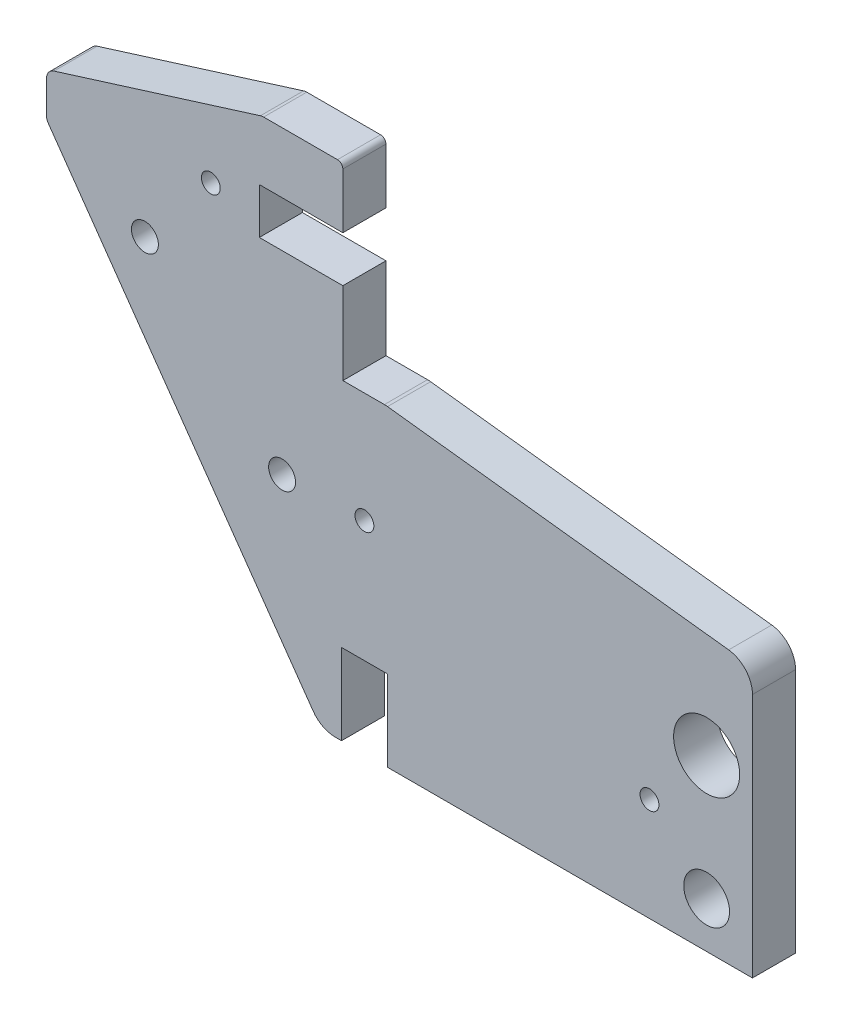
ISO-10303-21;
HEADER;
FILE_DESCRIPTION(('STEP AP214'),'2;1');
FILE_NAME('part.step','',(''),(''),'','','');
FILE_SCHEMA(('AUTOMOTIVE_DESIGN { 1 0 10303 214 1 1 1 1 }'));
ENDSEC;
DATA;
#1=APPLICATION_CONTEXT('core data for automotive mechanical design processes');
#2=APPLICATION_PROTOCOL_DEFINITION('international standard','automotive_design',2000,#1);
#3=PRODUCT_CONTEXT('',#1,'mechanical');
#4=PRODUCT('Part','Part','',(#3));
#5=PRODUCT_RELATED_PRODUCT_CATEGORY('part','',(#4));
#6=PRODUCT_DEFINITION_FORMATION('','',#4);
#7=PRODUCT_DEFINITION_CONTEXT('part definition',#1,'design');
#8=PRODUCT_DEFINITION('design','',#6,#7);
#9=PRODUCT_DEFINITION_SHAPE('','',#8);
#10=(LENGTH_UNIT() NAMED_UNIT(*) SI_UNIT(.MILLI.,.METRE.));
#11=(NAMED_UNIT(*) PLANE_ANGLE_UNIT() SI_UNIT($,.RADIAN.));
#12=(NAMED_UNIT(*) SI_UNIT($,.STERADIAN.) SOLID_ANGLE_UNIT());
#13=UNCERTAINTY_MEASURE_WITH_UNIT(LENGTH_MEASURE(1.E-05),#10,'distance_accuracy_value','');
#14=(GEOMETRIC_REPRESENTATION_CONTEXT(3) GLOBAL_UNCERTAINTY_ASSIGNED_CONTEXT((#13)) GLOBAL_UNIT_ASSIGNED_CONTEXT((#10,
#11,#12)) REPRESENTATION_CONTEXT('',''));
#15=CARTESIAN_POINT('',(0.,0.,0.));
#16=DIRECTION('',(0.,0.,1.));
#17=DIRECTION('',(1.,0.,0.));
#18=AXIS2_PLACEMENT_3D('',#15,#16,#17);
#19=CARTESIAN_POINT('',(59.608556797873,87.7800724779219,8.));
#20=DIRECTION('',(-1.,0.,0.));
#21=DIRECTION('',(0.,0.,1.));
#22=AXIS2_PLACEMENT_3D('',#19,#20,#21);
#23=PLANE('',#22);
#24=DIRECTION('',(0.,1.,0.));
#25=VECTOR('',#24,1.);
#26=CARTESIAN_POINT('',(59.608556797873,87.7800724779219,0.));
#27=LINE('',#26,#25);
#28=CARTESIAN_POINT('',(59.608556797873,64.2800724779219,0.));
#29=VERTEX_POINT('',#28);
#30=CARTESIAN_POINT('',(59.608556797873,79.5300724779219,0.));
#31=VERTEX_POINT('',#30);
#32=EDGE_CURVE('E264',#29,#31,#27,.T.);
#33=ORIENTED_EDGE('',*,*,#32,.T.);
#34=DIRECTION('',(0.,0.,1.));
#35=VECTOR('',#34,1.);
#36=CARTESIAN_POINT('',(59.608556797873,79.5300724779219,8.));
#37=LINE('',#36,#35);
#38=CARTESIAN_POINT('',(59.608556797873,79.5300724779219,8.));
#39=VERTEX_POINT('',#38);
#40=EDGE_CURVE('E45',#31,#39,#37,.T.);
#41=ORIENTED_EDGE('',*,*,#40,.T.);
#42=DIRECTION('',(0.,1.,0.));
#43=VECTOR('',#42,1.);
#44=CARTESIAN_POINT('',(59.608556797873,64.2800724779219,8.));
#45=LINE('',#44,#43);
#46=CARTESIAN_POINT('',(59.608556797873,64.2800724779219,8.));
#47=VERTEX_POINT('',#46);
#48=EDGE_CURVE('E220',#47,#39,#45,.T.);
#49=ORIENTED_EDGE('',*,*,#48,.F.);
#50=DIRECTION('',(0.,0.,-1.));
#51=VECTOR('',#50,1.);
#52=CARTESIAN_POINT('',(59.608556797873,64.2800724779219,8.));
#53=LINE('',#52,#51);
#54=EDGE_CURVE('E263',#47,#29,#53,.T.);
#55=ORIENTED_EDGE('',*,*,#54,.T.);
#56=EDGE_LOOP('',(#33,#41,#49,#55));
#57=FACE_BOUND('',#56,.T.);
#58=ADVANCED_FACE('F37',(#57),#23,.F.);
#59=CARTESIAN_POINT('',(67.608556797873,6.28007247792189,8.));
#60=DIRECTION('',(0.,1.,0.));
#61=DIRECTION('',(0.,0.,1.));
#62=AXIS2_PLACEMENT_3D('',#59,#60,#61);
#63=PLANE('',#62);
#64=DIRECTION('',(1.,0.,0.));
#65=VECTOR('',#64,1.);
#66=CARTESIAN_POINT('',(58.2044968260079,6.28007247792189,8.));
#67=LINE('',#66,#65);
#68=CARTESIAN_POINT('',(67.858556797873,6.28007247792189,8.));
#69=VERTEX_POINT('',#68);
#70=CARTESIAN_POINT('',(135.608556797873,6.28007247792189,8.));
#71=VERTEX_POINT('',#70);
#72=EDGE_CURVE('E249',#69,#71,#67,.T.);
#73=ORIENTED_EDGE('',*,*,#72,.F.);
#74=DIRECTION('',(0.,0.,-1.));
#75=VECTOR('',#74,1.);
#76=CARTESIAN_POINT('',(67.858556797873,6.28007247792189,8.));
#77=LINE('',#76,#75);
#78=CARTESIAN_POINT('',(67.858556797873,6.28007247792189,0.));
#79=VERTEX_POINT('',#78);
#80=EDGE_CURVE('E345',#69,#79,#77,.T.);
#81=ORIENTED_EDGE('',*,*,#80,.T.);
#82=DIRECTION('',(1.,0.,0.));
#83=VECTOR('',#82,1.);
#84=CARTESIAN_POINT('',(67.608556797873,6.28007247792189,0.));
#85=LINE('',#84,#83);
#86=CARTESIAN_POINT('',(135.608556797873,6.28007247792189,0.));
#87=VERTEX_POINT('',#86);
#88=EDGE_CURVE('E287',#79,#87,#85,.T.);
#89=ORIENTED_EDGE('',*,*,#88,.T.);
#90=DIRECTION('',(0.,0.,-1.));
#91=VECTOR('',#90,1.);
#92=CARTESIAN_POINT('',(135.608556797873,6.28007247792189,8.));
#93=LINE('',#92,#91);
#94=EDGE_CURVE('E312',#71,#87,#93,.T.);
#95=ORIENTED_EDGE('',*,*,#94,.F.);
#96=EDGE_LOOP('',(#73,#81,#89,#95));
#97=FACE_BOUND('',#96,.T.);
#98=ADVANCED_FACE('F438',(#97),#63,.F.);
#99=CARTESIAN_POINT('',(58.608556797873,98.2800724779219,8.));
#100=DIRECTION('',(0.,0.,1.));
#101=DIRECTION('',(1.,0.,0.));
#102=AXIS2_PLACEMENT_3D('',#99,#100,#101);
#103=PLANE('',#102);
#104=CARTESIAN_POINT('',(22.8806347365152,69.0079945392798,8.));
#105=DIRECTION('',(0.,0.,-1.));
#106=DIRECTION('',(-1.,0.,0.));
#107=AXIS2_PLACEMENT_3D('',#104,#105,#106);
#108=CIRCLE('',#107,2.49999999999998);
#109=CARTESIAN_POINT('',(20.3806347365152,69.0079945392798,8.));
#110=VERTEX_POINT('',#109);
#111=EDGE_CURVE('E215',#110,#110,#108,.T.);
#112=ORIENTED_EDGE('',*,*,#111,.T.);
#113=EDGE_LOOP('',(#112));
#114=FACE_BOUND('',#113,.T.);
#115=CARTESIAN_POINT('',(48.3364788592307,43.5521504165639,8.));
#116=DIRECTION('',(0.,0.,-1.));
#117=DIRECTION('',(-1.,0.,0.));
#118=AXIS2_PLACEMENT_3D('',#115,#116,#117);
#119=CIRCLE('',#118,2.5);
#120=CARTESIAN_POINT('',(45.8364788592307,43.5521504165639,8.));
#121=VERTEX_POINT('',#120);
#122=EDGE_CURVE('E822',#121,#121,#119,.T.);
#123=ORIENTED_EDGE('',*,*,#122,.T.);
#124=EDGE_LOOP('',(#123));
#125=FACE_BOUND('',#124,.T.);
#126=DIRECTION('',(1.,0.,0.));
#127=VECTOR('',#126,1.);
#128=CARTESIAN_POINT('',(59.608556797873,79.5300724779219,8.));
#129=LINE('',#128,#127);
#130=CARTESIAN_POINT('',(44.108556797873,79.5300724779219,8.));
#131=VERTEX_POINT('',#130);
#132=EDGE_CURVE('E354',#131,#39,#129,.T.);
#133=ORIENTED_EDGE('',*,*,#132,.F.);
#134=DIRECTION('',(0.,-1.,0.));
#135=VECTOR('',#134,1.);
#136=CARTESIAN_POINT('',(44.108556797873,79.5300724779219,8.));
#137=LINE('',#136,#135);
#138=CARTESIAN_POINT('',(44.108556797873,88.0300724779219,8.));
#139=VERTEX_POINT('',#138);
#140=EDGE_CURVE('E214',#139,#131,#137,.T.);
#141=ORIENTED_EDGE('',*,*,#140,.F.);
#142=DIRECTION('',(-1.,0.,0.));
#143=VECTOR('',#142,1.);
#144=CARTESIAN_POINT('',(59.608556797873,88.0300724779219,8.));
#145=LINE('',#144,#143);
#146=CARTESIAN_POINT('',(59.608556797873,88.0300724779219,8.));
#147=VERTEX_POINT('',#146);
#148=EDGE_CURVE('E200',#147,#139,#145,.T.);
#149=ORIENTED_EDGE('',*,*,#148,.F.);
#150=CARTESIAN_POINT('',(59.608556797873,98.2800724779219,8.));
#151=VERTEX_POINT('',#150);
#152=EDGE_CURVE('E211',#147,#151,#45,.T.);
#153=ORIENTED_EDGE('',*,*,#152,.T.);
#154=CARTESIAN_POINT('',(58.608556797873,98.2800724779219,8.));
#155=DIRECTION('',(0.,0.,1.));
#156=DIRECTION('',(1.,0.,0.));
#157=AXIS2_PLACEMENT_3D('',#154,#155,#156);
#158=CIRCLE('',#157,0.999999999999997);
#159=CARTESIAN_POINT('',(58.608556797873,99.2800724779219,8.));
#160=VERTEX_POINT('',#159);
#161=EDGE_CURVE('E224',#151,#160,#158,.T.);
#162=ORIENTED_EDGE('',*,*,#161,.T.);
#163=DIRECTION('',(-1.,0.,0.));
#164=VECTOR('',#163,1.);
#165=CARTESIAN_POINT('',(58.608556797873,99.2800724779219,8.));
#166=LINE('',#165,#164);
#167=CARTESIAN_POINT('',(44.9137786435696,99.2800724779219,8.));
#168=VERTEX_POINT('',#167);
#169=EDGE_CURVE('E233',#160,#168,#166,.T.);
#170=ORIENTED_EDGE('',*,*,#169,.T.);
#171=CARTESIAN_POINT('',(44.913778643569,97.2800724779222,8.));
#172=DIRECTION('',(0.,0.,1.));
#173=DIRECTION('',(1.,0.,0.));
#174=AXIS2_PLACEMENT_3D('',#171,#172,#173);
#175=CIRCLE('',#174,1.99999999999971);
#176=CARTESIAN_POINT('',(44.3172286572978,99.1890324339921,8.));
#177=VERTEX_POINT('',#176);
#178=EDGE_CURVE('E235',#168,#177,#175,.T.);
#179=ORIENTED_EDGE('',*,*,#178,.T.);
#180=DIRECTION('',(-0.954479978035029,-0.298274993135948,0.));
#181=VECTOR('',#180,1.);
#182=CARTESIAN_POINT('',(44.3172286572978,99.1890324339921,8.));
#183=LINE('',#182,#181);
#184=CARTESIAN_POINT('',(6.0120068116009,87.2186506072118,8.));
#185=VERTEX_POINT('',#184);
#186=EDGE_CURVE('E237',#177,#185,#183,.T.);
#187=ORIENTED_EDGE('',*,*,#186,.T.);
#188=CARTESIAN_POINT('',(6.60855679787301,85.3096906511418,8.));
#189=DIRECTION('',(0.,0.,1.));
#190=DIRECTION('',(1.,0.,0.));
#191=AXIS2_PLACEMENT_3D('',#188,#189,#190);
#192=CIRCLE('',#191,2.00000000000004);
#193=CARTESIAN_POINT('',(4.60855679787297,85.3096906511416,8.));
#194=VERTEX_POINT('',#193);
#195=EDGE_CURVE('E239',#185,#194,#192,.T.);
#196=ORIENTED_EDGE('',*,*,#195,.T.);
#197=DIRECTION('',(0.,-1.,0.));
#198=VECTOR('',#197,1.);
#199=CARTESIAN_POINT('',(4.60855679787296,85.3096906511416,8.));
#200=LINE('',#199,#198);
#201=CARTESIAN_POINT('',(4.60855679787296,79.4130579841159,8.));
#202=VERTEX_POINT('',#201);
#203=EDGE_CURVE('E241',#194,#202,#200,.T.);
#204=ORIENTED_EDGE('',*,*,#203,.T.);
#205=CARTESIAN_POINT('',(6.60855679787274,79.4130579841162,8.));
#206=DIRECTION('',(0.,0.,1.));
#207=DIRECTION('',(1.,0.,0.));
#208=AXIS2_PLACEMENT_3D('',#205,#206,#207);
#209=CIRCLE('',#208,1.99999999999978);
#210=CARTESIAN_POINT('',(4.97274733410991,78.262350637193,8.));
#211=VERTEX_POINT('',#210);
#212=EDGE_CURVE('E243',#202,#211,#209,.T.);
#213=ORIENTED_EDGE('',*,*,#212,.T.);
#214=DIRECTION('',(0.575353673461539,-0.8179047318816,0.));
#215=VECTOR('',#214,1.);
#216=CARTESIAN_POINT('',(4.97274733410991,78.262350637193,8.));
#217=LINE('',#216,#215);
#218=CARTESIAN_POINT('',(54.1149731665998,8.40330411061419,8.));
#219=VERTEX_POINT('',#218);
#220=EDGE_CURVE('E245',#211,#219,#217,.T.);
#221=ORIENTED_EDGE('',*,*,#220,.T.);
#222=CARTESIAN_POINT('',(58.2044968260078,11.280072477922,8.));
#223=DIRECTION('',(0.,0.,1.));
#224=DIRECTION('',(1.,0.,0.));
#225=AXIS2_PLACEMENT_3D('',#222,#223,#224);
#226=CIRCLE('',#225,5.00000000000007);
#227=CARTESIAN_POINT('',(58.2044968260079,6.28007247792189,8.));
#228=VERTEX_POINT('',#227);
#229=EDGE_CURVE('E247',#219,#228,#226,.T.);
#230=ORIENTED_EDGE('',*,*,#229,.T.);
#231=CARTESIAN_POINT('',(59.358556797873,6.28007247792189,8.));
#232=VERTEX_POINT('',#231);
#233=EDGE_CURVE('E250',#228,#232,#67,.T.);
#234=ORIENTED_EDGE('',*,*,#233,.T.);
#235=DIRECTION('',(0.,-1.,0.));
#236=VECTOR('',#235,1.);
#237=CARTESIAN_POINT('',(59.358556797873,6.28007247792189,8.));
#238=LINE('',#237,#236);
#239=CARTESIAN_POINT('',(59.358556797873,21.2800724779219,8.));
#240=VERTEX_POINT('',#239);
#241=EDGE_CURVE('E60',#240,#232,#238,.T.);
#242=ORIENTED_EDGE('',*,*,#241,.F.);
#243=DIRECTION('',(-1.,0.,0.));
#244=VECTOR('',#243,1.);
#245=CARTESIAN_POINT('',(67.858556797873,21.2800724779219,8.));
#246=LINE('',#245,#244);
#247=CARTESIAN_POINT('',(67.858556797873,21.2800724779219,8.));
#248=VERTEX_POINT('',#247);
#249=EDGE_CURVE('E372',#248,#240,#246,.T.);
#250=ORIENTED_EDGE('',*,*,#249,.F.);
#251=DIRECTION('',(0.,1.,0.));
#252=VECTOR('',#251,1.);
#253=CARTESIAN_POINT('',(67.858556797873,6.28007247792189,8.));
#254=LINE('',#253,#252);
#255=EDGE_CURVE('E369',#69,#248,#254,.T.);
#256=ORIENTED_EDGE('',*,*,#255,.F.);
#257=ORIENTED_EDGE('',*,*,#72,.T.);
#258=DIRECTION('',(0.,1.,0.));
#259=VECTOR('',#258,1.);
#260=CARTESIAN_POINT('',(135.608556797873,6.28007247792189,8.));
#261=LINE('',#260,#259);
#262=CARTESIAN_POINT('',(135.608556797873,51.8338246047971,8.));
#263=VERTEX_POINT('',#262);
#264=EDGE_CURVE('E253',#71,#263,#261,.T.);
#265=ORIENTED_EDGE('',*,*,#264,.T.);
#266=CARTESIAN_POINT('',(130.608556797873,51.8338246047972,8.));
#267=DIRECTION('',(0.,0.,1.));
#268=DIRECTION('',(1.,0.,0.));
#269=AXIS2_PLACEMENT_3D('',#266,#267,#268);
#270=CIRCLE('',#269,5.00000000000012);
#271=CARTESIAN_POINT('',(131.19276303571,56.7995776264117,8.));
#272=VERTEX_POINT('',#271);
#273=EDGE_CURVE('E255',#263,#272,#270,.T.);
#274=ORIENTED_EDGE('',*,*,#273,.T.);
#275=DIRECTION('',(-0.993150604322876,0.116841247567397,0.));
#276=VECTOR('',#275,1.);
#277=CARTESIAN_POINT('',(131.19276303571,56.7995776264117,8.));
#278=LINE('',#277,#276);
#279=CARTESIAN_POINT('',(67.8996561141493,64.2458254995364,8.));
#280=VERTEX_POINT('',#279);
#281=EDGE_CURVE('E257',#272,#280,#278,.T.);
#282=ORIENTED_EDGE('',*,*,#281,.T.);
#283=CARTESIAN_POINT('',(67.3154498763137,59.2800724779223,8.));
#284=DIRECTION('',(0.,0.,1.));
#285=DIRECTION('',(1.,0.,0.));
#286=AXIS2_PLACEMENT_3D('',#283,#284,#285);
#287=CIRCLE('',#286,4.99999999999959);
#288=CARTESIAN_POINT('',(67.3154498763124,64.2800724779219,8.));
#289=VERTEX_POINT('',#288);
#290=EDGE_CURVE('E259',#280,#289,#287,.T.);
#291=ORIENTED_EDGE('',*,*,#290,.T.);
#292=DIRECTION('',(-1.,0.,0.));
#293=VECTOR('',#292,1.);
#294=CARTESIAN_POINT('',(67.3154498763124,64.2800724779219,8.));
#295=LINE('',#294,#293);
#296=EDGE_CURVE('E261',#289,#47,#295,.T.);
#297=ORIENTED_EDGE('',*,*,#296,.T.);
#298=ORIENTED_EDGE('',*,*,#48,.T.);
#299=EDGE_LOOP('',(#133,#141,#149,#153,#162,#170,#179,#187,#196,#204,#213,#221,#230,#234,#242,
#250,#256,#257,#265,#274,#282,#291,#297,#298));
#300=FACE_BOUND('',#299,.T.);
#301=CARTESIAN_POINT('',(63.608556797873,43.7800724779219,8.));
#302=DIRECTION('',(0.,0.,1.));
#303=DIRECTION('',(1.,0.,0.));
#304=AXIS2_PLACEMENT_3D('',#301,#302,#303);
#305=CIRCLE('',#304,1.75);
#306=CARTESIAN_POINT('',(65.358556797873,43.7800724779219,8.));
#307=VERTEX_POINT('',#306);
#308=EDGE_CURVE('E398',#307,#307,#305,.T.);
#309=ORIENTED_EDGE('',*,*,#308,.F.);
#310=EDGE_LOOP('',(#309));
#311=FACE_BOUND('',#310,.T.);
#312=CARTESIAN_POINT('',(127.108556797873,14.7800724779219,8.));
#313=DIRECTION('',(0.,0.,1.));
#314=DIRECTION('',(1.,0.,0.));
#315=AXIS2_PLACEMENT_3D('',#312,#313,#314);
#316=CIRCLE('',#315,4.25);
#317=CARTESIAN_POINT('',(131.358556797873,14.7800724779219,8.));
#318=VERTEX_POINT('',#317);
#319=EDGE_CURVE('E410',#318,#318,#316,.T.);
#320=ORIENTED_EDGE('',*,*,#319,.F.);
#321=EDGE_LOOP('',(#320));
#322=FACE_BOUND('',#321,.T.);
#323=CARTESIAN_POINT('',(127.108556797873,37.7800724779219,8.));
#324=DIRECTION('',(0.,0.,1.));
#325=DIRECTION('',(1.,0.,0.));
#326=AXIS2_PLACEMENT_3D('',#323,#324,#325);
#327=CIRCLE('',#326,6.12499999999999);
#328=CARTESIAN_POINT('',(133.233556797873,37.7800724779219,8.));
#329=VERTEX_POINT('',#328);
#330=EDGE_CURVE('E414',#329,#329,#327,.T.);
#331=ORIENTED_EDGE('',*,*,#330,.F.);
#332=EDGE_LOOP('',(#331));
#333=FACE_BOUND('',#332,.T.);
#334=CARTESIAN_POINT('',(116.501954797873,25.3866741957201,8.));
#335=DIRECTION('',(0.,0.,1.));
#336=DIRECTION('',(1.,0.,0.));
#337=AXIS2_PLACEMENT_3D('',#334,#335,#336);
#338=CIRCLE('',#337,1.75);
#339=CARTESIAN_POINT('',(118.251954797873,25.3866741957201,8.));
#340=VERTEX_POINT('',#339);
#341=EDGE_CURVE('E404',#340,#340,#338,.T.);
#342=ORIENTED_EDGE('',*,*,#341,.F.);
#343=EDGE_LOOP('',(#342));
#344=FACE_BOUND('',#343,.T.);
#345=CARTESIAN_POINT('',(35.108556797873,83.7800724779219,8.));
#346=DIRECTION('',(0.,0.,1.));
#347=DIRECTION('',(1.,0.,0.));
#348=AXIS2_PLACEMENT_3D('',#345,#346,#347);
#349=CIRCLE('',#348,1.75);
#350=CARTESIAN_POINT('',(36.858556797873,83.7800724779219,8.));
#351=VERTEX_POINT('',#350);
#352=EDGE_CURVE('E392',#351,#351,#349,.T.);
#353=ORIENTED_EDGE('',*,*,#352,.F.);
#354=EDGE_LOOP('',(#353));
#355=FACE_BOUND('',#354,.T.);
#356=ADVANCED_FACE('F209',(#114,#125,#300,#311,#322,#333,#344,#355),#103,.T.);
#357=CARTESIAN_POINT('',(58.608556797873,98.2800724779219,0.));
#358=DIRECTION('',(0.,0.,1.));
#359=DIRECTION('',(1.,0.,0.));
#360=AXIS2_PLACEMENT_3D('',#357,#358,#359);
#361=PLANE('',#360);
#362=CARTESIAN_POINT('',(22.8806347365152,69.0079945392798,0.));
#363=DIRECTION('',(0.,0.,-1.));
#364=DIRECTION('',(-1.,0.,0.));
#365=AXIS2_PLACEMENT_3D('',#362,#363,#364);
#366=CIRCLE('',#365,2.49999999999998);
#367=CARTESIAN_POINT('',(20.3806347365152,69.0079945392798,0.));
#368=VERTEX_POINT('',#367);
#369=EDGE_CURVE('E817',#368,#368,#366,.T.);
#370=ORIENTED_EDGE('',*,*,#369,.F.);
#371=EDGE_LOOP('',(#370));
#372=FACE_BOUND('',#371,.T.);
#373=CARTESIAN_POINT('',(48.3364788592307,43.5521504165639,0.));
#374=DIRECTION('',(0.,0.,-1.));
#375=DIRECTION('',(-1.,0.,0.));
#376=AXIS2_PLACEMENT_3D('',#373,#374,#375);
#377=CIRCLE('',#376,2.5);
#378=CARTESIAN_POINT('',(45.8364788592307,43.5521504165639,0.));
#379=VERTEX_POINT('',#378);
#380=EDGE_CURVE('E818',#379,#379,#377,.T.);
#381=ORIENTED_EDGE('',*,*,#380,.F.);
#382=EDGE_LOOP('',(#381));
#383=FACE_BOUND('',#382,.T.);
#384=DIRECTION('',(0.,-1.,0.));
#385=VECTOR('',#384,1.);
#386=CARTESIAN_POINT('',(44.108556797873,98.2800724779219,0.));
#387=LINE('',#386,#385);
#388=CARTESIAN_POINT('',(44.108556797873,88.0300724779219,0.));
#389=VERTEX_POINT('',#388);
#390=CARTESIAN_POINT('',(44.108556797873,79.5300724779219,0.));
#391=VERTEX_POINT('',#390);
#392=EDGE_CURVE('E11',#389,#391,#387,.T.);
#393=ORIENTED_EDGE('',*,*,#392,.T.);
#394=DIRECTION('',(1.,0.,0.));
#395=VECTOR('',#394,1.);
#396=CARTESIAN_POINT('',(58.608556797873,79.5300724779219,0.));
#397=LINE('',#396,#395);
#398=EDGE_CURVE('E367',#391,#31,#397,.T.);
#399=ORIENTED_EDGE('',*,*,#398,.T.);
#400=ORIENTED_EDGE('',*,*,#32,.F.);
#401=DIRECTION('',(-1.,0.,0.));
#402=VECTOR('',#401,1.);
#403=CARTESIAN_POINT('',(67.3154498763124,64.2800724779219,0.));
#404=LINE('',#403,#402);
#405=CARTESIAN_POINT('',(67.3154498763124,64.2800724779219,0.));
#406=VERTEX_POINT('',#405);
#407=EDGE_CURVE('E221',#406,#29,#404,.T.);
#408=ORIENTED_EDGE('',*,*,#407,.F.);
#409=CARTESIAN_POINT('',(67.3154498763137,59.2800724779223,0.));
#410=DIRECTION('',(0.,0.,1.));
#411=DIRECTION('',(1.,0.,0.));
#412=AXIS2_PLACEMENT_3D('',#409,#410,#411);
#413=CIRCLE('',#412,4.99999999999959);
#414=CARTESIAN_POINT('',(67.8996561141493,64.2458254995364,0.));
#415=VERTEX_POINT('',#414);
#416=EDGE_CURVE('E226',#415,#406,#413,.T.);
#417=ORIENTED_EDGE('',*,*,#416,.F.);
#418=DIRECTION('',(-0.993150604322876,0.116841247567397,0.));
#419=VECTOR('',#418,1.);
#420=CARTESIAN_POINT('',(131.19276303571,56.7995776264117,0.));
#421=LINE('',#420,#419);
#422=CARTESIAN_POINT('',(131.19276303571,56.7995776264117,0.));
#423=VERTEX_POINT('',#422);
#424=EDGE_CURVE('E295',#423,#415,#421,.T.);
#425=ORIENTED_EDGE('',*,*,#424,.F.);
#426=CARTESIAN_POINT('',(130.608556797873,51.8338246047972,0.));
#427=DIRECTION('',(0.,0.,1.));
#428=DIRECTION('',(1.,0.,0.));
#429=AXIS2_PLACEMENT_3D('',#426,#427,#428);
#430=CIRCLE('',#429,5.00000000000012);
#431=CARTESIAN_POINT('',(135.608556797873,51.8338246047971,0.));
#432=VERTEX_POINT('',#431);
#433=EDGE_CURVE('E293',#432,#423,#430,.T.);
#434=ORIENTED_EDGE('',*,*,#433,.F.);
#435=DIRECTION('',(0.,1.,0.));
#436=VECTOR('',#435,1.);
#437=CARTESIAN_POINT('',(135.608556797873,6.28007247792189,0.));
#438=LINE('',#437,#436);
#439=EDGE_CURVE('E291',#87,#432,#438,.T.);
#440=ORIENTED_EDGE('',*,*,#439,.F.);
#441=ORIENTED_EDGE('',*,*,#88,.F.);
#442=DIRECTION('',(0.,1.,0.));
#443=VECTOR('',#442,1.);
#444=CARTESIAN_POINT('',(67.858556797873,98.2800724779219,0.));
#445=LINE('',#444,#443);
#446=CARTESIAN_POINT('',(67.858556797873,21.2800724779219,0.));
#447=VERTEX_POINT('',#446);
#448=EDGE_CURVE('E388',#79,#447,#445,.T.);
#449=ORIENTED_EDGE('',*,*,#448,.T.);
#450=DIRECTION('',(-1.,0.,0.));
#451=VECTOR('',#450,1.);
#452=CARTESIAN_POINT('',(58.608556797873,21.2800724779219,0.));
#453=LINE('',#452,#451);
#454=CARTESIAN_POINT('',(59.358556797873,21.2800724779219,0.));
#455=VERTEX_POINT('',#454);
#456=EDGE_CURVE('E205',#447,#455,#453,.T.);
#457=ORIENTED_EDGE('',*,*,#456,.T.);
#458=DIRECTION('',(0.,-1.,0.));
#459=VECTOR('',#458,1.);
#460=CARTESIAN_POINT('',(59.358556797873,98.2800724779219,0.));
#461=LINE('',#460,#459);
#462=CARTESIAN_POINT('',(59.358556797873,6.28007247792189,0.));
#463=VERTEX_POINT('',#462);
#464=EDGE_CURVE('E384',#455,#463,#461,.T.);
#465=ORIENTED_EDGE('',*,*,#464,.T.);
#466=CARTESIAN_POINT('',(58.2044968260079,6.28007247792189,0.));
#467=VERTEX_POINT('',#466);
#468=EDGE_CURVE('E288',#467,#463,#85,.T.);
#469=ORIENTED_EDGE('',*,*,#468,.F.);
#470=CARTESIAN_POINT('',(58.2044968260078,11.280072477922,0.));
#471=DIRECTION('',(0.,0.,1.));
#472=DIRECTION('',(1.,0.,0.));
#473=AXIS2_PLACEMENT_3D('',#470,#471,#472);
#474=CIRCLE('',#473,5.00000000000007);
#475=CARTESIAN_POINT('',(54.1149731665998,8.40330411061419,0.));
#476=VERTEX_POINT('',#475);
#477=EDGE_CURVE('E284',#476,#467,#474,.T.);
#478=ORIENTED_EDGE('',*,*,#477,.F.);
#479=DIRECTION('',(0.575353673461539,-0.8179047318816,0.));
#480=VECTOR('',#479,1.);
#481=CARTESIAN_POINT('',(4.97274733410991,78.262350637193,0.));
#482=LINE('',#481,#480);
#483=CARTESIAN_POINT('',(4.97274733410991,78.262350637193,0.));
#484=VERTEX_POINT('',#483);
#485=EDGE_CURVE('E282',#484,#476,#482,.T.);
#486=ORIENTED_EDGE('',*,*,#485,.F.);
#487=CARTESIAN_POINT('',(6.60855679787274,79.4130579841162,0.));
#488=DIRECTION('',(0.,0.,1.));
#489=DIRECTION('',(1.,0.,0.));
#490=AXIS2_PLACEMENT_3D('',#487,#488,#489);
#491=CIRCLE('',#490,1.99999999999978);
#492=CARTESIAN_POINT('',(4.60855679787296,79.4130579841159,0.));
#493=VERTEX_POINT('',#492);
#494=EDGE_CURVE('E280',#493,#484,#491,.T.);
#495=ORIENTED_EDGE('',*,*,#494,.F.);
#496=DIRECTION('',(0.,-1.,0.));
#497=VECTOR('',#496,1.);
#498=CARTESIAN_POINT('',(4.60855679787296,85.3096906511416,0.));
#499=LINE('',#498,#497);
#500=CARTESIAN_POINT('',(4.60855679787297,85.3096906511416,0.));
#501=VERTEX_POINT('',#500);
#502=EDGE_CURVE('E278',#501,#493,#499,.T.);
#503=ORIENTED_EDGE('',*,*,#502,.F.);
#504=CARTESIAN_POINT('',(6.60855679787301,85.3096906511418,0.));
#505=DIRECTION('',(0.,0.,1.));
#506=DIRECTION('',(1.,0.,0.));
#507=AXIS2_PLACEMENT_3D('',#504,#505,#506);
#508=CIRCLE('',#507,2.00000000000004);
#509=CARTESIAN_POINT('',(6.0120068116009,87.2186506072118,0.));
#510=VERTEX_POINT('',#509);
#511=EDGE_CURVE('E276',#510,#501,#508,.T.);
#512=ORIENTED_EDGE('',*,*,#511,.F.);
#513=DIRECTION('',(-0.954479978035029,-0.298274993135948,0.));
#514=VECTOR('',#513,1.);
#515=CARTESIAN_POINT('',(44.3172286572978,99.1890324339921,0.));
#516=LINE('',#515,#514);
#517=CARTESIAN_POINT('',(44.3172286572978,99.1890324339921,0.));
#518=VERTEX_POINT('',#517);
#519=EDGE_CURVE('E274',#518,#510,#516,.T.);
#520=ORIENTED_EDGE('',*,*,#519,.F.);
#521=CARTESIAN_POINT('',(44.913778643569,97.2800724779222,0.));
#522=DIRECTION('',(0.,0.,1.));
#523=DIRECTION('',(1.,0.,0.));
#524=AXIS2_PLACEMENT_3D('',#521,#522,#523);
#525=CIRCLE('',#524,1.99999999999971);
#526=CARTESIAN_POINT('',(44.9137786435696,99.2800724779219,0.));
#527=VERTEX_POINT('',#526);
#528=EDGE_CURVE('E272',#527,#518,#525,.T.);
#529=ORIENTED_EDGE('',*,*,#528,.F.);
#530=DIRECTION('',(-1.,0.,0.));
#531=VECTOR('',#530,1.);
#532=CARTESIAN_POINT('',(58.608556797873,99.2800724779219,0.));
#533=LINE('',#532,#531);
#534=CARTESIAN_POINT('',(58.608556797873,99.2800724779219,0.));
#535=VERTEX_POINT('',#534);
#536=EDGE_CURVE('E270',#535,#527,#533,.T.);
#537=ORIENTED_EDGE('',*,*,#536,.F.);
#538=CARTESIAN_POINT('',(58.608556797873,98.2800724779219,0.));
#539=DIRECTION('',(0.,0.,1.));
#540=DIRECTION('',(1.,0.,0.));
#541=AXIS2_PLACEMENT_3D('',#538,#539,#540);
#542=CIRCLE('',#541,0.999999999999997);
#543=CARTESIAN_POINT('',(59.608556797873,98.2800724779219,0.));
#544=VERTEX_POINT('',#543);
#545=EDGE_CURVE('E267',#544,#535,#542,.T.);
#546=ORIENTED_EDGE('',*,*,#545,.F.);
#547=CARTESIAN_POINT('',(59.608556797873,88.0300724779219,0.));
#548=VERTEX_POINT('',#547);
#549=EDGE_CURVE('E268',#548,#544,#27,.T.);
#550=ORIENTED_EDGE('',*,*,#549,.F.);
#551=DIRECTION('',(-1.,0.,0.));
#552=VECTOR('',#551,1.);
#553=CARTESIAN_POINT('',(58.608556797873,88.0300724779219,0.));
#554=LINE('',#553,#552);
#555=EDGE_CURVE('E52',#548,#389,#554,.T.);
#556=ORIENTED_EDGE('',*,*,#555,.T.);
#557=EDGE_LOOP('',(#393,#399,#400,#408,#417,#425,#434,#440,#441,#449,#457,#465,#469,#478,#486,
#495,#503,#512,#520,#529,#537,#546,#550,#556));
#558=FACE_BOUND('',#557,.T.);
#559=CARTESIAN_POINT('',(63.608556797873,43.7800724779219,0.));
#560=DIRECTION('',(0.,0.,1.));
#561=DIRECTION('',(1.,0.,0.));
#562=AXIS2_PLACEMENT_3D('',#559,#560,#561);
#563=CIRCLE('',#562,1.75);
#564=CARTESIAN_POINT('',(65.358556797873,43.7800724779219,0.));
#565=VERTEX_POINT('',#564);
#566=EDGE_CURVE('E395',#565,#565,#563,.T.);
#567=ORIENTED_EDGE('',*,*,#566,.T.);
#568=EDGE_LOOP('',(#567));
#569=FACE_BOUND('',#568,.T.);
#570=CARTESIAN_POINT('',(127.108556797873,14.7800724779219,0.));
#571=DIRECTION('',(0.,0.,1.));
#572=DIRECTION('',(1.,0.,0.));
#573=AXIS2_PLACEMENT_3D('',#570,#571,#572);
#574=CIRCLE('',#573,4.25);
#575=CARTESIAN_POINT('',(131.358556797873,14.7800724779219,0.));
#576=VERTEX_POINT('',#575);
#577=EDGE_CURVE('E407',#576,#576,#574,.T.);
#578=ORIENTED_EDGE('',*,*,#577,.T.);
#579=EDGE_LOOP('',(#578));
#580=FACE_BOUND('',#579,.T.);
#581=CARTESIAN_POINT('',(127.108556797873,37.7800724779219,0.));
#582=DIRECTION('',(0.,0.,1.));
#583=DIRECTION('',(1.,0.,0.));
#584=AXIS2_PLACEMENT_3D('',#581,#582,#583);
#585=CIRCLE('',#584,6.12499999999999);
#586=CARTESIAN_POINT('',(133.233556797873,37.7800724779219,0.));
#587=VERTEX_POINT('',#586);
#588=EDGE_CURVE('E230',#587,#587,#585,.T.);
#589=ORIENTED_EDGE('',*,*,#588,.T.);
#590=EDGE_LOOP('',(#589));
#591=FACE_BOUND('',#590,.T.);
#592=CARTESIAN_POINT('',(116.501954797873,25.3866741957201,0.));
#593=DIRECTION('',(0.,0.,1.));
#594=DIRECTION('',(1.,0.,0.));
#595=AXIS2_PLACEMENT_3D('',#592,#593,#594);
#596=CIRCLE('',#595,1.75);
#597=CARTESIAN_POINT('',(118.251954797873,25.3866741957201,0.));
#598=VERTEX_POINT('',#597);
#599=EDGE_CURVE('E401',#598,#598,#596,.T.);
#600=ORIENTED_EDGE('',*,*,#599,.T.);
#601=EDGE_LOOP('',(#600));
#602=FACE_BOUND('',#601,.T.);
#603=CARTESIAN_POINT('',(35.108556797873,83.7800724779219,0.));
#604=DIRECTION('',(0.,0.,1.));
#605=DIRECTION('',(1.,0.,0.));
#606=AXIS2_PLACEMENT_3D('',#603,#604,#605);
#607=CIRCLE('',#606,1.75);
#608=CARTESIAN_POINT('',(36.858556797873,83.7800724779219,0.));
#609=VERTEX_POINT('',#608);
#610=EDGE_CURVE('E391',#609,#609,#607,.T.);
#611=ORIENTED_EDGE('',*,*,#610,.T.);
#612=EDGE_LOOP('',(#611));
#613=FACE_BOUND('',#612,.T.);
#614=ADVANCED_FACE('F364',(#372,#383,#558,#569,#580,#591,#602,#613),#361,.F.);
#615=ORIENTED_EDGE('',*,*,#152,.F.);
#616=DIRECTION('',(0.,0.,-1.));
#617=VECTOR('',#616,1.);
#618=CARTESIAN_POINT('',(59.608556797873,88.0300724779219,8.));
#619=LINE('',#618,#617);
#620=EDGE_CURVE('E197',#147,#548,#619,.T.);
#621=ORIENTED_EDGE('',*,*,#620,.T.);
#622=ORIENTED_EDGE('',*,*,#549,.T.);
#623=DIRECTION('',(0.,0.,-1.));
#624=VECTOR('',#623,1.);
#625=CARTESIAN_POINT('',(59.608556797873,98.2800724779219,8.));
#626=LINE('',#625,#624);
#627=EDGE_CURVE('E218',#151,#544,#626,.T.);
#628=ORIENTED_EDGE('',*,*,#627,.F.);
#629=EDGE_LOOP('',(#615,#621,#622,#628));
#630=FACE_BOUND('',#629,.T.);
#631=ADVANCED_FACE('F39',(#630),#23,.F.);
#632=CARTESIAN_POINT('',(58.608556797873,98.2800724779219,8.));
#633=DIRECTION('',(0.,0.,-1.));
#634=DIRECTION('',(-1.,0.,0.));
#635=AXIS2_PLACEMENT_3D('',#632,#633,#634);
#636=CYLINDRICAL_SURFACE('',#635,0.999999999999997);
#637=ORIENTED_EDGE('',*,*,#545,.T.);
#638=DIRECTION('',(0.,0.,-1.));
#639=VECTOR('',#638,1.);
#640=CARTESIAN_POINT('',(58.608556797873,99.2800724779219,8.));
#641=LINE('',#640,#639);
#642=EDGE_CURVE('E339',#160,#535,#641,.T.);
#643=ORIENTED_EDGE('',*,*,#642,.F.);
#644=ORIENTED_EDGE('',*,*,#161,.F.);
#645=ORIENTED_EDGE('',*,*,#627,.T.);
#646=EDGE_LOOP('',(#637,#643,#644,#645));
#647=FACE_BOUND('',#646,.T.);
#648=ADVANCED_FACE('F446',(#647),#636,.T.);
#649=CARTESIAN_POINT('',(58.608556797873,99.2800724779219,8.));
#650=DIRECTION('',(0.,-1.,0.));
#651=DIRECTION('',(0.,0.,-1.));
#652=AXIS2_PLACEMENT_3D('',#649,#650,#651);
#653=PLANE('',#652);
#654=ORIENTED_EDGE('',*,*,#536,.T.);
#655=DIRECTION('',(0.,0.,-1.));
#656=VECTOR('',#655,1.);
#657=CARTESIAN_POINT('',(44.9137786435696,99.2800724779219,8.));
#658=LINE('',#657,#656);
#659=EDGE_CURVE('E336',#168,#527,#658,.T.);
#660=ORIENTED_EDGE('',*,*,#659,.F.);
#661=ORIENTED_EDGE('',*,*,#169,.F.);
#662=ORIENTED_EDGE('',*,*,#642,.T.);
#663=EDGE_LOOP('',(#654,#660,#661,#662));
#664=FACE_BOUND('',#663,.T.);
#665=ADVANCED_FACE('F451',(#664),#653,.F.);
#666=CARTESIAN_POINT('',(44.913778643569,97.2800724779222,8.));
#667=DIRECTION('',(0.,0.,-1.));
#668=DIRECTION('',(-1.,0.,0.));
#669=AXIS2_PLACEMENT_3D('',#666,#667,#668);
#670=CYLINDRICAL_SURFACE('',#669,1.99999999999971);
#671=ORIENTED_EDGE('',*,*,#528,.T.);
#672=DIRECTION('',(0.,0.,-1.));
#673=VECTOR('',#672,1.);
#674=CARTESIAN_POINT('',(44.3172286572978,99.1890324339921,8.));
#675=LINE('',#674,#673);
#676=EDGE_CURVE('E333',#177,#518,#675,.T.);
#677=ORIENTED_EDGE('',*,*,#676,.F.);
#678=ORIENTED_EDGE('',*,*,#178,.F.);
#679=ORIENTED_EDGE('',*,*,#659,.T.);
#680=EDGE_LOOP('',(#671,#677,#678,#679));
#681=FACE_BOUND('',#680,.T.);
#682=ADVANCED_FACE('F503',(#681),#670,.T.);
#683=CARTESIAN_POINT('',(44.3172286572978,99.1890324339921,8.));
#684=DIRECTION('',(0.298274993135948,-0.954479978035029,0.));
#685=DIRECTION('',(0.954479978035029,0.298274993135948,0.));
#686=AXIS2_PLACEMENT_3D('',#683,#684,#685);
#687=PLANE('',#686);
#688=ORIENTED_EDGE('',*,*,#519,.T.);
#689=DIRECTION('',(0.,0.,-1.));
#690=VECTOR('',#689,1.);
#691=CARTESIAN_POINT('',(6.0120068116009,87.2186506072118,8.));
#692=LINE('',#691,#690);
#693=EDGE_CURVE('E330',#185,#510,#692,.T.);
#694=ORIENTED_EDGE('',*,*,#693,.F.);
#695=ORIENTED_EDGE('',*,*,#186,.F.);
#696=ORIENTED_EDGE('',*,*,#676,.T.);
#697=EDGE_LOOP('',(#688,#694,#695,#696));
#698=FACE_BOUND('',#697,.T.);
#699=ADVANCED_FACE('F499',(#698),#687,.F.);
#700=CARTESIAN_POINT('',(6.60855679787301,85.3096906511418,8.));
#701=DIRECTION('',(0.,0.,-1.));
#702=DIRECTION('',(-1.,0.,0.));
#703=AXIS2_PLACEMENT_3D('',#700,#701,#702);
#704=CYLINDRICAL_SURFACE('',#703,2.00000000000004);
#705=ORIENTED_EDGE('',*,*,#511,.T.);
#706=DIRECTION('',(0.,0.,-1.));
#707=VECTOR('',#706,1.);
#708=CARTESIAN_POINT('',(4.60855679787297,85.3096906511416,8.));
#709=LINE('',#708,#707);
#710=EDGE_CURVE('E327',#194,#501,#709,.T.);
#711=ORIENTED_EDGE('',*,*,#710,.F.);
#712=ORIENTED_EDGE('',*,*,#195,.F.);
#713=ORIENTED_EDGE('',*,*,#693,.T.);
#714=EDGE_LOOP('',(#705,#711,#712,#713));
#715=FACE_BOUND('',#714,.T.);
#716=ADVANCED_FACE('F495',(#715),#704,.T.);
#717=CARTESIAN_POINT('',(4.60855679787296,85.3096906511416,8.));
#718=DIRECTION('',(1.,0.,0.));
#719=DIRECTION('',(0.,0.,-1.));
#720=AXIS2_PLACEMENT_3D('',#717,#718,#719);
#721=PLANE('',#720);
#722=ORIENTED_EDGE('',*,*,#502,.T.);
#723=DIRECTION('',(0.,0.,-1.));
#724=VECTOR('',#723,1.);
#725=CARTESIAN_POINT('',(4.60855679787296,79.4130579841159,8.));
#726=LINE('',#725,#724);
#727=EDGE_CURVE('E324',#202,#493,#726,.T.);
#728=ORIENTED_EDGE('',*,*,#727,.F.);
#729=ORIENTED_EDGE('',*,*,#203,.F.);
#730=ORIENTED_EDGE('',*,*,#710,.T.);
#731=EDGE_LOOP('',(#722,#728,#729,#730));
#732=FACE_BOUND('',#731,.T.);
#733=ADVANCED_FACE('F491',(#732),#721,.F.);
#734=CARTESIAN_POINT('',(6.60855679787274,79.4130579841162,8.));
#735=DIRECTION('',(0.,0.,-1.));
#736=DIRECTION('',(-1.,0.,0.));
#737=AXIS2_PLACEMENT_3D('',#734,#735,#736);
#738=CYLINDRICAL_SURFACE('',#737,1.99999999999978);
#739=ORIENTED_EDGE('',*,*,#494,.T.);
#740=DIRECTION('',(0.,0.,-1.));
#741=VECTOR('',#740,1.);
#742=CARTESIAN_POINT('',(4.97274733410991,78.262350637193,8.));
#743=LINE('',#742,#741);
#744=EDGE_CURVE('E321',#211,#484,#743,.T.);
#745=ORIENTED_EDGE('',*,*,#744,.F.);
#746=ORIENTED_EDGE('',*,*,#212,.F.);
#747=ORIENTED_EDGE('',*,*,#727,.T.);
#748=EDGE_LOOP('',(#739,#745,#746,#747));
#749=FACE_BOUND('',#748,.T.);
#750=ADVANCED_FACE('F487',(#749),#738,.T.);
#751=CARTESIAN_POINT('',(4.97274733410991,78.262350637193,8.));
#752=DIRECTION('',(0.817904731881601,0.575353673461539,0.));
#753=DIRECTION('',(-0.575353673461539,0.8179047318816,0.));
#754=AXIS2_PLACEMENT_3D('',#751,#752,#753);
#755=PLANE('',#754);
#756=ORIENTED_EDGE('',*,*,#485,.T.);
#757=DIRECTION('',(0.,0.,-1.));
#758=VECTOR('',#757,1.);
#759=CARTESIAN_POINT('',(54.1149731665998,8.40330411061419,8.));
#760=LINE('',#759,#758);
#761=EDGE_CURVE('E318',#219,#476,#760,.T.);
#762=ORIENTED_EDGE('',*,*,#761,.F.);
#763=ORIENTED_EDGE('',*,*,#220,.F.);
#764=ORIENTED_EDGE('',*,*,#744,.T.);
#765=EDGE_LOOP('',(#756,#762,#763,#764));
#766=FACE_BOUND('',#765,.T.);
#767=ADVANCED_FACE('F483',(#766),#755,.F.);
#768=CARTESIAN_POINT('',(58.2044968260078,11.280072477922,8.));
#769=DIRECTION('',(0.,0.,-1.));
#770=DIRECTION('',(-1.,0.,0.));
#771=AXIS2_PLACEMENT_3D('',#768,#769,#770);
#772=CYLINDRICAL_SURFACE('',#771,5.00000000000007);
#773=ORIENTED_EDGE('',*,*,#477,.T.);
#774=DIRECTION('',(0.,0.,-1.));
#775=VECTOR('',#774,1.);
#776=CARTESIAN_POINT('',(58.2044968260079,6.28007247792189,8.));
#777=LINE('',#776,#775);
#778=EDGE_CURVE('E315',#228,#467,#777,.T.);
#779=ORIENTED_EDGE('',*,*,#778,.F.);
#780=ORIENTED_EDGE('',*,*,#229,.F.);
#781=ORIENTED_EDGE('',*,*,#761,.T.);
#782=EDGE_LOOP('',(#773,#779,#780,#781));
#783=FACE_BOUND('',#782,.T.);
#784=ADVANCED_FACE('F479',(#783),#772,.T.);
#785=ORIENTED_EDGE('',*,*,#468,.T.);
#786=DIRECTION('',(0.,0.,1.));
#787=VECTOR('',#786,1.);
#788=CARTESIAN_POINT('',(59.358556797873,6.28007247792189,8.));
#789=LINE('',#788,#787);
#790=EDGE_CURVE('E343',#463,#232,#789,.T.);
#791=ORIENTED_EDGE('',*,*,#790,.T.);
#792=ORIENTED_EDGE('',*,*,#233,.F.);
#793=ORIENTED_EDGE('',*,*,#778,.T.);
#794=EDGE_LOOP('',(#785,#791,#792,#793));
#795=FACE_BOUND('',#794,.T.);
#796=ADVANCED_FACE('F444',(#795),#63,.F.);
#797=CARTESIAN_POINT('',(135.608556797873,6.28007247792189,8.));
#798=DIRECTION('',(-1.,0.,0.));
#799=DIRECTION('',(0.,0.,1.));
#800=AXIS2_PLACEMENT_3D('',#797,#798,#799);
#801=PLANE('',#800);
#802=ORIENTED_EDGE('',*,*,#439,.T.);
#803=DIRECTION('',(0.,0.,-1.));
#804=VECTOR('',#803,1.);
#805=CARTESIAN_POINT('',(135.608556797873,51.8338246047971,8.));
#806=LINE('',#805,#804);
#807=EDGE_CURVE('E309',#263,#432,#806,.T.);
#808=ORIENTED_EDGE('',*,*,#807,.F.);
#809=ORIENTED_EDGE('',*,*,#264,.F.);
#810=ORIENTED_EDGE('',*,*,#94,.T.);
#811=EDGE_LOOP('',(#802,#808,#809,#810));
#812=FACE_BOUND('',#811,.T.);
#813=ADVANCED_FACE('F473',(#812),#801,.F.);
#814=CARTESIAN_POINT('',(130.608556797873,51.8338246047972,8.));
#815=DIRECTION('',(0.,0.,-1.));
#816=DIRECTION('',(-1.,0.,0.));
#817=AXIS2_PLACEMENT_3D('',#814,#815,#816);
#818=CYLINDRICAL_SURFACE('',#817,5.00000000000012);
#819=ORIENTED_EDGE('',*,*,#433,.T.);
#820=DIRECTION('',(0.,0.,-1.));
#821=VECTOR('',#820,1.);
#822=CARTESIAN_POINT('',(131.19276303571,56.7995776264117,8.));
#823=LINE('',#822,#821);
#824=EDGE_CURVE('E306',#272,#423,#823,.T.);
#825=ORIENTED_EDGE('',*,*,#824,.F.);
#826=ORIENTED_EDGE('',*,*,#273,.F.);
#827=ORIENTED_EDGE('',*,*,#807,.T.);
#828=EDGE_LOOP('',(#819,#825,#826,#827));
#829=FACE_BOUND('',#828,.T.);
#830=ADVANCED_FACE('F469',(#829),#818,.T.);
#831=CARTESIAN_POINT('',(131.19276303571,56.7995776264117,8.));
#832=DIRECTION('',(-0.116841247567397,-0.993150604322876,0.));
#833=DIRECTION('',(0.993150604322876,-0.116841247567397,0.));
#834=AXIS2_PLACEMENT_3D('',#831,#832,#833);
#835=PLANE('',#834);
#836=ORIENTED_EDGE('',*,*,#424,.T.);
#837=DIRECTION('',(0.,0.,-1.));
#838=VECTOR('',#837,1.);
#839=CARTESIAN_POINT('',(67.8996561141493,64.2458254995364,8.));
#840=LINE('',#839,#838);
#841=EDGE_CURVE('E303',#280,#415,#840,.T.);
#842=ORIENTED_EDGE('',*,*,#841,.F.);
#843=ORIENTED_EDGE('',*,*,#281,.F.);
#844=ORIENTED_EDGE('',*,*,#824,.T.);
#845=EDGE_LOOP('',(#836,#842,#843,#844));
#846=FACE_BOUND('',#845,.T.);
#847=ADVANCED_FACE('F465',(#846),#835,.F.);
#848=CARTESIAN_POINT('',(67.3154498763137,59.2800724779223,8.));
#849=DIRECTION('',(0.,0.,-1.));
#850=DIRECTION('',(-1.,0.,0.));
#851=AXIS2_PLACEMENT_3D('',#848,#849,#850);
#852=CYLINDRICAL_SURFACE('',#851,4.99999999999959);
#853=ORIENTED_EDGE('',*,*,#416,.T.);
#854=DIRECTION('',(0.,0.,-1.));
#855=VECTOR('',#854,1.);
#856=CARTESIAN_POINT('',(67.3154498763124,64.2800724779219,8.));
#857=LINE('',#856,#855);
#858=EDGE_CURVE('E300',#289,#406,#857,.T.);
#859=ORIENTED_EDGE('',*,*,#858,.F.);
#860=ORIENTED_EDGE('',*,*,#290,.F.);
#861=ORIENTED_EDGE('',*,*,#841,.T.);
#862=EDGE_LOOP('',(#853,#859,#860,#861));
#863=FACE_BOUND('',#862,.T.);
#864=ADVANCED_FACE('F434',(#863),#852,.T.);
#865=CARTESIAN_POINT('',(67.3154498763124,64.2800724779219,8.));
#866=DIRECTION('',(0.,-1.,0.));
#867=DIRECTION('',(0.,0.,-1.));
#868=AXIS2_PLACEMENT_3D('',#865,#866,#867);
#869=PLANE('',#868);
#870=ORIENTED_EDGE('',*,*,#407,.T.);
#871=ORIENTED_EDGE('',*,*,#54,.F.);
#872=ORIENTED_EDGE('',*,*,#296,.F.);
#873=ORIENTED_EDGE('',*,*,#858,.T.);
#874=EDGE_LOOP('',(#870,#871,#872,#873));
#875=FACE_BOUND('',#874,.T.);
#876=ADVANCED_FACE('F360',(#875),#869,.F.);
#877=CARTESIAN_POINT('',(127.108556797873,37.7800724779219,8.));
#878=DIRECTION('',(0.,0.,-1.));
#879=DIRECTION('',(-1.,0.,0.));
#880=AXIS2_PLACEMENT_3D('',#877,#878,#879);
#881=CYLINDRICAL_SURFACE('',#880,6.12499999999999);
#882=ORIENTED_EDGE('',*,*,#330,.T.);
#883=EDGE_LOOP('',(#882));
#884=FACE_BOUND('',#883,.T.);
#885=ORIENTED_EDGE('',*,*,#588,.F.);
#886=EDGE_LOOP('',(#885));
#887=FACE_BOUND('',#886,.T.);
#888=ADVANCED_FACE('F423',(#884,#887),#881,.F.);
#889=CARTESIAN_POINT('',(127.108556797873,14.7800724779219,8.));
#890=DIRECTION('',(0.,0.,-1.));
#891=DIRECTION('',(-1.,0.,0.));
#892=AXIS2_PLACEMENT_3D('',#889,#890,#891);
#893=CYLINDRICAL_SURFACE('',#892,4.25);
#894=ORIENTED_EDGE('',*,*,#319,.T.);
#895=EDGE_LOOP('',(#894));
#896=FACE_BOUND('',#895,.T.);
#897=ORIENTED_EDGE('',*,*,#577,.F.);
#898=EDGE_LOOP('',(#897));
#899=FACE_BOUND('',#898,.T.);
#900=ADVANCED_FACE('F425',(#896,#899),#893,.F.);
#901=CARTESIAN_POINT('',(116.501954797873,25.3866741957201,8.));
#902=DIRECTION('',(0.,0.,-1.));
#903=DIRECTION('',(-1.,0.,0.));
#904=AXIS2_PLACEMENT_3D('',#901,#902,#903);
#905=CYLINDRICAL_SURFACE('',#904,1.75);
#906=ORIENTED_EDGE('',*,*,#341,.T.);
#907=EDGE_LOOP('',(#906));
#908=FACE_BOUND('',#907,.T.);
#909=ORIENTED_EDGE('',*,*,#599,.F.);
#910=EDGE_LOOP('',(#909));
#911=FACE_BOUND('',#910,.T.);
#912=ADVANCED_FACE('F431',(#908,#911),#905,.F.);
#913=CARTESIAN_POINT('',(63.608556797873,43.7800724779219,8.));
#914=DIRECTION('',(0.,0.,-1.));
#915=DIRECTION('',(-1.,0.,0.));
#916=AXIS2_PLACEMENT_3D('',#913,#914,#915);
#917=CYLINDRICAL_SURFACE('',#916,1.75);
#918=ORIENTED_EDGE('',*,*,#308,.T.);
#919=EDGE_LOOP('',(#918));
#920=FACE_BOUND('',#919,.T.);
#921=ORIENTED_EDGE('',*,*,#566,.F.);
#922=EDGE_LOOP('',(#921));
#923=FACE_BOUND('',#922,.T.);
#924=ADVANCED_FACE('F572',(#920,#923),#917,.F.);
#925=CARTESIAN_POINT('',(35.108556797873,83.7800724779219,8.));
#926=DIRECTION('',(0.,0.,-1.));
#927=DIRECTION('',(-1.,0.,0.));
#928=AXIS2_PLACEMENT_3D('',#925,#926,#927);
#929=CYLINDRICAL_SURFACE('',#928,1.75);
#930=ORIENTED_EDGE('',*,*,#352,.T.);
#931=EDGE_LOOP('',(#930));
#932=FACE_BOUND('',#931,.T.);
#933=ORIENTED_EDGE('',*,*,#610,.F.);
#934=EDGE_LOOP('',(#933));
#935=FACE_BOUND('',#934,.T.);
#936=ADVANCED_FACE('F567',(#932,#935),#929,.F.);
#937=CARTESIAN_POINT('',(67.858556797873,21.2800724779219,-2.));
#938=DIRECTION('',(0.,1.,0.));
#939=DIRECTION('',(-1.,0.,0.));
#940=AXIS2_PLACEMENT_3D('',#937,#938,#939);
#941=PLANE('',#940);
#942=DIRECTION('',(0.,0.,1.));
#943=VECTOR('',#942,1.);
#944=CARTESIAN_POINT('',(67.858556797873,21.2800724779219,-2.));
#945=LINE('',#944,#943);
#946=EDGE_CURVE('E381',#447,#248,#945,.T.);
#947=ORIENTED_EDGE('',*,*,#946,.T.);
#948=ORIENTED_EDGE('',*,*,#249,.T.);
#949=DIRECTION('',(0.,0.,1.));
#950=VECTOR('',#949,1.);
#951=CARTESIAN_POINT('',(59.358556797873,21.2800724779219,-2.));
#952=LINE('',#951,#950);
#953=EDGE_CURVE('E382',#455,#240,#952,.T.);
#954=ORIENTED_EDGE('',*,*,#953,.F.);
#955=ORIENTED_EDGE('',*,*,#456,.F.);
#956=EDGE_LOOP('',(#947,#948,#954,#955));
#957=FACE_BOUND('',#956,.T.);
#958=ADVANCED_FACE('F544',(#957),#941,.F.);
#959=CARTESIAN_POINT('',(67.858556797873,6.28007247792189,-2.));
#960=DIRECTION('',(1.,0.,0.));
#961=DIRECTION('',(0.,0.,-1.));
#962=AXIS2_PLACEMENT_3D('',#959,#960,#961);
#963=PLANE('',#962);
#964=ORIENTED_EDGE('',*,*,#80,.F.);
#965=ORIENTED_EDGE('',*,*,#255,.T.);
#966=ORIENTED_EDGE('',*,*,#946,.F.);
#967=ORIENTED_EDGE('',*,*,#448,.F.);
#968=EDGE_LOOP('',(#964,#965,#966,#967));
#969=FACE_BOUND('',#968,.T.);
#970=ADVANCED_FACE('F546',(#969),#963,.F.);
#971=CARTESIAN_POINT('',(59.358556797873,6.28007247792189,-2.));
#972=DIRECTION('',(-1.,0.,0.));
#973=DIRECTION('',(0.,0.,1.));
#974=AXIS2_PLACEMENT_3D('',#971,#972,#973);
#975=PLANE('',#974);
#976=ORIENTED_EDGE('',*,*,#953,.T.);
#977=ORIENTED_EDGE('',*,*,#241,.T.);
#978=ORIENTED_EDGE('',*,*,#790,.F.);
#979=ORIENTED_EDGE('',*,*,#464,.F.);
#980=EDGE_LOOP('',(#976,#977,#978,#979));
#981=FACE_BOUND('',#980,.T.);
#982=ADVANCED_FACE('F539',(#981),#975,.F.);
#983=CARTESIAN_POINT('',(44.108556797873,79.5300724779219,-2.));
#984=DIRECTION('',(-1.,0.,0.));
#985=DIRECTION('',(0.,0.,1.));
#986=AXIS2_PLACEMENT_3D('',#983,#984,#985);
#987=PLANE('',#986);
#988=DIRECTION('',(0.,0.,1.));
#989=VECTOR('',#988,1.);
#990=CARTESIAN_POINT('',(44.108556797873,88.0300724779219,-2.));
#991=LINE('',#990,#989);
#992=EDGE_CURVE('E829',#389,#139,#991,.T.);
#993=ORIENTED_EDGE('',*,*,#992,.T.);
#994=ORIENTED_EDGE('',*,*,#140,.T.);
#995=DIRECTION('',(0.,0.,1.));
#996=VECTOR('',#995,1.);
#997=CARTESIAN_POINT('',(44.108556797873,79.5300724779219,-2.));
#998=LINE('',#997,#996);
#999=EDGE_CURVE('E374',#391,#131,#998,.T.);
#1000=ORIENTED_EDGE('',*,*,#999,.F.);
#1001=ORIENTED_EDGE('',*,*,#392,.F.);
#1002=EDGE_LOOP('',(#993,#994,#1000,#1001));
#1003=FACE_BOUND('',#1002,.T.);
#1004=ADVANCED_FACE('F565',(#1003),#987,.F.);
#1005=CARTESIAN_POINT('',(59.608556797873,79.5300724779219,-2.));
#1006=DIRECTION('',(0.,-1.,0.));
#1007=DIRECTION('',(0.,0.,-1.));
#1008=AXIS2_PLACEMENT_3D('',#1005,#1006,#1007);
#1009=PLANE('',#1008);
#1010=ORIENTED_EDGE('',*,*,#999,.T.);
#1011=ORIENTED_EDGE('',*,*,#132,.T.);
#1012=ORIENTED_EDGE('',*,*,#40,.F.);
#1013=ORIENTED_EDGE('',*,*,#398,.F.);
#1014=EDGE_LOOP('',(#1010,#1011,#1012,#1013));
#1015=FACE_BOUND('',#1014,.T.);
#1016=ADVANCED_FACE('F627',(#1015),#1009,.F.);
#1017=CARTESIAN_POINT('',(59.608556797873,88.0300724779219,-2.));
#1018=DIRECTION('',(0.,1.,0.));
#1019=DIRECTION('',(-1.,0.,0.));
#1020=AXIS2_PLACEMENT_3D('',#1017,#1018,#1019);
#1021=PLANE('',#1020);
#1022=ORIENTED_EDGE('',*,*,#620,.F.);
#1023=ORIENTED_EDGE('',*,*,#148,.T.);
#1024=ORIENTED_EDGE('',*,*,#992,.F.);
#1025=ORIENTED_EDGE('',*,*,#555,.F.);
#1026=EDGE_LOOP('',(#1022,#1023,#1024,#1025));
#1027=FACE_BOUND('',#1026,.T.);
#1028=ADVANCED_FACE('F199',(#1027),#1021,.F.);
#1029=CARTESIAN_POINT('',(48.3364788592307,43.5521504165639,8.));
#1030=DIRECTION('',(0.,0.,-1.));
#1031=DIRECTION('',(-1.,0.,0.));
#1032=AXIS2_PLACEMENT_3D('',#1029,#1030,#1031);
#1033=CYLINDRICAL_SURFACE('',#1032,2.5);
#1034=ORIENTED_EDGE('',*,*,#122,.F.);
#1035=EDGE_LOOP('',(#1034));
#1036=FACE_BOUND('',#1035,.T.);
#1037=ORIENTED_EDGE('',*,*,#380,.T.);
#1038=EDGE_LOOP('',(#1037));
#1039=FACE_BOUND('',#1038,.T.);
#1040=ADVANCED_FACE('F644',(#1036,#1039),#1033,.F.);
#1041=CARTESIAN_POINT('',(22.8806347365152,69.0079945392798,8.));
#1042=DIRECTION('',(0.,0.,-1.));
#1043=DIRECTION('',(-1.,0.,0.));
#1044=AXIS2_PLACEMENT_3D('',#1041,#1042,#1043);
#1045=CYLINDRICAL_SURFACE('',#1044,2.49999999999998);
#1046=ORIENTED_EDGE('',*,*,#111,.F.);
#1047=EDGE_LOOP('',(#1046));
#1048=FACE_BOUND('',#1047,.T.);
#1049=ORIENTED_EDGE('',*,*,#369,.T.);
#1050=EDGE_LOOP('',(#1049));
#1051=FACE_BOUND('',#1050,.T.);
#1052=ADVANCED_FACE('F799',(#1048,#1051),#1045,.F.);
#1053=CLOSED_SHELL('',(#58,#98,#356,#614,#631,#648,#665,#682,#699,#716,#733,#750,#767,#784,#796,
#813,#830,#847,#864,#876,#888,#900,#912,#924,#936,#958,#970,#982,#1004,#1016,#1028,#1040,#1052));
#1054=MANIFOLD_SOLID_BREP('B2',#1053);
#1055=ADVANCED_BREP_SHAPE_REPRESENTATION('',(#18,#1054),#14);
#1056=SHAPE_DEFINITION_REPRESENTATION(#9,#1055);
ENDSEC;
END-ISO-10303-21;
